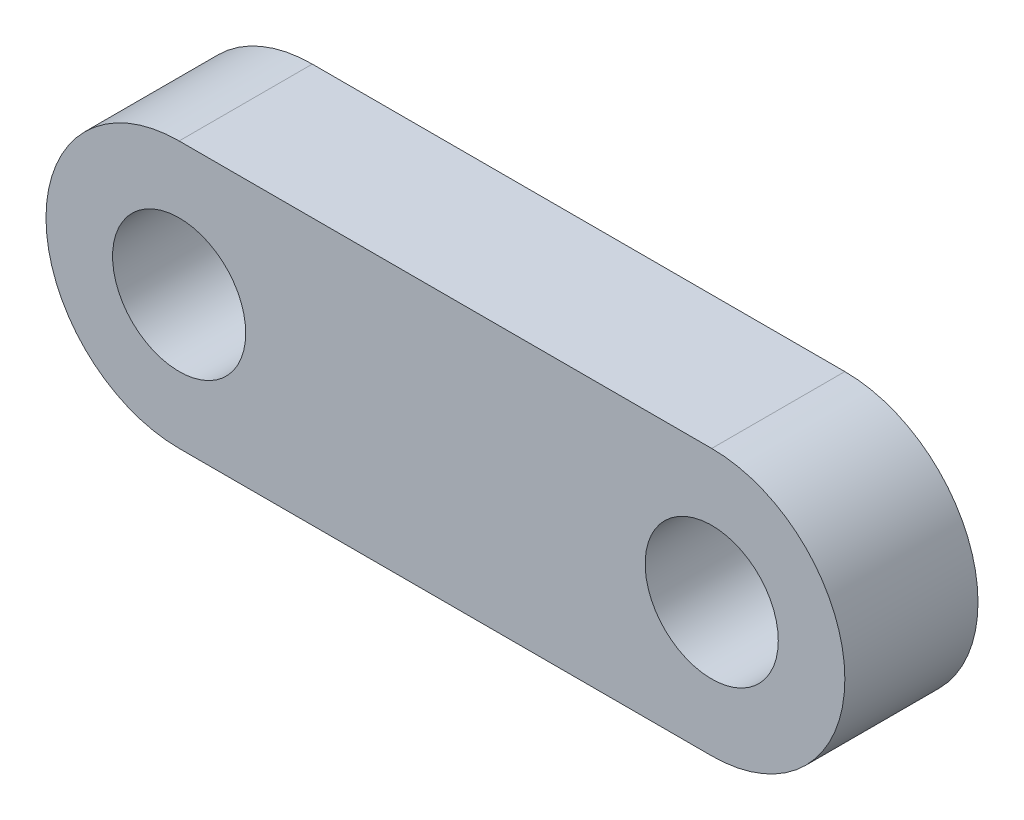
ISO-10303-21;
HEADER;
FILE_DESCRIPTION(('STEP AP214'),'2;1');
FILE_NAME('part.step','',(''),(''),'','','');
FILE_SCHEMA(('AUTOMOTIVE_DESIGN { 1 0 10303 214 1 1 1 1 }'));
ENDSEC;
DATA;
#1=APPLICATION_CONTEXT('core data for automotive mechanical design processes');
#2=APPLICATION_PROTOCOL_DEFINITION('international standard','automotive_design',2000,#1);
#3=PRODUCT_CONTEXT('',#1,'mechanical');
#4=PRODUCT('Part','Part','',(#3));
#5=PRODUCT_RELATED_PRODUCT_CATEGORY('part','',(#4));
#6=PRODUCT_DEFINITION_FORMATION('','',#4);
#7=PRODUCT_DEFINITION_CONTEXT('part definition',#1,'design');
#8=PRODUCT_DEFINITION('design','',#6,#7);
#9=PRODUCT_DEFINITION_SHAPE('','',#8);
#10=(LENGTH_UNIT() NAMED_UNIT(*) SI_UNIT(.MILLI.,.METRE.));
#11=(NAMED_UNIT(*) PLANE_ANGLE_UNIT() SI_UNIT($,.RADIAN.));
#12=(NAMED_UNIT(*) SI_UNIT($,.STERADIAN.) SOLID_ANGLE_UNIT());
#13=UNCERTAINTY_MEASURE_WITH_UNIT(LENGTH_MEASURE(1.E-05),#10,'distance_accuracy_value','');
#14=(GEOMETRIC_REPRESENTATION_CONTEXT(3) GLOBAL_UNCERTAINTY_ASSIGNED_CONTEXT((#13)) GLOBAL_UNIT_ASSIGNED_CONTEXT((#10,
#11,#12)) REPRESENTATION_CONTEXT('',''));
#15=CARTESIAN_POINT('',(0.,0.,0.));
#16=DIRECTION('',(0.,0.,1.));
#17=DIRECTION('',(1.,0.,0.));
#18=AXIS2_PLACEMENT_3D('',#15,#16,#17);
#19=CARTESIAN_POINT('',(0.,0.,2.5));
#20=DIRECTION('',(0.,0.,1.));
#21=DIRECTION('',(1.,0.,0.));
#22=AXIS2_PLACEMENT_3D('',#19,#20,#21);
#23=PLANE('',#22);
#24=CARTESIAN_POINT('',(0.,0.,2.5));
#25=DIRECTION('',(0.,0.,1.));
#26=DIRECTION('',(1.,0.,0.));
#27=AXIS2_PLACEMENT_3D('',#24,#25,#26);
#28=CIRCLE('',#27,1.25);
#29=CARTESIAN_POINT('',(1.25,0.,2.5));
#30=VERTEX_POINT('',#29);
#31=EDGE_CURVE('E100',#30,#30,#28,.T.);
#32=ORIENTED_EDGE('',*,*,#31,.F.);
#33=EDGE_LOOP('',(#32));
#34=FACE_BOUND('',#33,.T.);
#35=CARTESIAN_POINT('',(0.,0.,2.5));
#36=DIRECTION('',(0.,0.,1.));
#37=DIRECTION('',(1.,0.,0.));
#38=AXIS2_PLACEMENT_3D('',#35,#36,#37);
#39=CIRCLE('',#38,2.5);
#40=CARTESIAN_POINT('',(0.,2.5,2.5));
#41=VERTEX_POINT('',#40);
#42=CARTESIAN_POINT('',(0.,-2.5,2.5));
#43=VERTEX_POINT('',#42);
#44=EDGE_CURVE('E85',#41,#43,#39,.T.);
#45=ORIENTED_EDGE('',*,*,#44,.T.);
#46=DIRECTION('',(1.,0.,0.));
#47=VECTOR('',#46,1.);
#48=CARTESIAN_POINT('',(0.,-2.5,2.5));
#49=LINE('',#48,#47);
#50=CARTESIAN_POINT('',(10.,-2.5,2.5));
#51=VERTEX_POINT('',#50);
#52=EDGE_CURVE('E80',#43,#51,#49,.T.);
#53=ORIENTED_EDGE('',*,*,#52,.T.);
#54=CARTESIAN_POINT('',(10.,0.,2.5));
#55=DIRECTION('',(0.,0.,1.));
#56=DIRECTION('',(1.,0.,0.));
#57=AXIS2_PLACEMENT_3D('',#54,#55,#56);
#58=CIRCLE('',#57,2.5);
#59=CARTESIAN_POINT('',(10.,2.5,2.5));
#60=VERTEX_POINT('',#59);
#61=EDGE_CURVE('E83',#51,#60,#58,.T.);
#62=ORIENTED_EDGE('',*,*,#61,.T.);
#63=DIRECTION('',(-1.,0.,0.));
#64=VECTOR('',#63,1.);
#65=CARTESIAN_POINT('',(0.,2.5,2.5));
#66=LINE('',#65,#64);
#67=EDGE_CURVE('E50',#60,#41,#66,.T.);
#68=ORIENTED_EDGE('',*,*,#67,.T.);
#69=EDGE_LOOP('',(#45,#53,#62,#68));
#70=FACE_BOUND('',#69,.T.);
#71=CARTESIAN_POINT('',(10.,0.,2.5));
#72=DIRECTION('',(0.,0.,1.));
#73=DIRECTION('',(1.,0.,0.));
#74=AXIS2_PLACEMENT_3D('',#71,#72,#73);
#75=CIRCLE('',#74,1.25);
#76=CARTESIAN_POINT('',(11.25,0.,2.5));
#77=VERTEX_POINT('',#76);
#78=EDGE_CURVE('E115',#77,#77,#75,.T.);
#79=ORIENTED_EDGE('',*,*,#78,.F.);
#80=EDGE_LOOP('',(#79));
#81=FACE_BOUND('',#80,.T.);
#82=ADVANCED_FACE('F33',(#34,#70,#81),#23,.T.);
#83=CARTESIAN_POINT('',(0.,0.,0.));
#84=DIRECTION('',(0.,0.,1.));
#85=DIRECTION('',(1.,0.,0.));
#86=AXIS2_PLACEMENT_3D('',#83,#84,#85);
#87=PLANE('',#86);
#88=CARTESIAN_POINT('',(0.,0.,0.));
#89=DIRECTION('',(0.,0.,1.));
#90=DIRECTION('',(1.,0.,0.));
#91=AXIS2_PLACEMENT_3D('',#88,#89,#90);
#92=CIRCLE('',#91,2.5);
#93=CARTESIAN_POINT('',(0.,2.5,0.));
#94=VERTEX_POINT('',#93);
#95=CARTESIAN_POINT('',(0.,-2.5,0.));
#96=VERTEX_POINT('',#95);
#97=EDGE_CURVE('E97',#94,#96,#92,.T.);
#98=ORIENTED_EDGE('',*,*,#97,.F.);
#99=DIRECTION('',(-1.,0.,0.));
#100=VECTOR('',#99,1.);
#101=CARTESIAN_POINT('',(0.,2.5,0.));
#102=LINE('',#101,#100);
#103=CARTESIAN_POINT('',(10.,2.5,0.));
#104=VERTEX_POINT('',#103);
#105=EDGE_CURVE('E73',#104,#94,#102,.T.);
#106=ORIENTED_EDGE('',*,*,#105,.F.);
#107=CARTESIAN_POINT('',(10.,0.,0.));
#108=DIRECTION('',(0.,0.,1.));
#109=DIRECTION('',(1.,0.,0.));
#110=AXIS2_PLACEMENT_3D('',#107,#108,#109);
#111=CIRCLE('',#110,2.5);
#112=CARTESIAN_POINT('',(10.,-2.5,0.));
#113=VERTEX_POINT('',#112);
#114=EDGE_CURVE('E67',#113,#104,#111,.T.);
#115=ORIENTED_EDGE('',*,*,#114,.F.);
#116=DIRECTION('',(1.,0.,0.));
#117=VECTOR('',#116,1.);
#118=CARTESIAN_POINT('',(0.,-2.5,0.));
#119=LINE('',#118,#117);
#120=EDGE_CURVE('E89',#96,#113,#119,.T.);
#121=ORIENTED_EDGE('',*,*,#120,.F.);
#122=EDGE_LOOP('',(#98,#106,#115,#121));
#123=FACE_BOUND('',#122,.T.);
#124=CARTESIAN_POINT('',(0.,0.,0.));
#125=DIRECTION('',(0.,0.,1.));
#126=DIRECTION('',(1.,0.,0.));
#127=AXIS2_PLACEMENT_3D('',#124,#125,#126);
#128=CIRCLE('',#127,1.25);
#129=CARTESIAN_POINT('',(1.25,0.,0.));
#130=VERTEX_POINT('',#129);
#131=EDGE_CURVE('E112',#130,#130,#128,.T.);
#132=ORIENTED_EDGE('',*,*,#131,.T.);
#133=EDGE_LOOP('',(#132));
#134=FACE_BOUND('',#133,.T.);
#135=CARTESIAN_POINT('',(10.,0.,0.));
#136=DIRECTION('',(0.,0.,1.));
#137=DIRECTION('',(1.,0.,0.));
#138=AXIS2_PLACEMENT_3D('',#135,#136,#137);
#139=CIRCLE('',#138,1.25);
#140=CARTESIAN_POINT('',(11.25,0.,0.));
#141=VERTEX_POINT('',#140);
#142=EDGE_CURVE('E118',#141,#141,#139,.T.);
#143=ORIENTED_EDGE('',*,*,#142,.T.);
#144=EDGE_LOOP('',(#143));
#145=FACE_BOUND('',#144,.T.);
#146=ADVANCED_FACE('F108',(#123,#134,#145),#87,.F.);
#147=CARTESIAN_POINT('',(0.,0.,2.5));
#148=DIRECTION('',(0.,0.,-1.));
#149=DIRECTION('',(-1.,0.,0.));
#150=AXIS2_PLACEMENT_3D('',#147,#148,#149);
#151=CYLINDRICAL_SURFACE('',#150,2.5);
#152=ORIENTED_EDGE('',*,*,#97,.T.);
#153=DIRECTION('',(0.,0.,-1.));
#154=VECTOR('',#153,1.);
#155=CARTESIAN_POINT('',(0.,-2.5,2.5));
#156=LINE('',#155,#154);
#157=EDGE_CURVE('E11',#43,#96,#156,.T.);
#158=ORIENTED_EDGE('',*,*,#157,.F.);
#159=ORIENTED_EDGE('',*,*,#44,.F.);
#160=DIRECTION('',(0.,0.,-1.));
#161=VECTOR('',#160,1.);
#162=CARTESIAN_POINT('',(0.,2.5,2.5));
#163=LINE('',#162,#161);
#164=EDGE_CURVE('E93',#41,#94,#163,.T.);
#165=ORIENTED_EDGE('',*,*,#164,.T.);
#166=EDGE_LOOP('',(#152,#158,#159,#165));
#167=FACE_BOUND('',#166,.T.);
#168=ADVANCED_FACE('F35',(#167),#151,.T.);
#169=CARTESIAN_POINT('',(0.,-2.5,2.5));
#170=DIRECTION('',(0.,1.,0.));
#171=DIRECTION('',(0.,0.,1.));
#172=AXIS2_PLACEMENT_3D('',#169,#170,#171);
#173=PLANE('',#172);
#174=ORIENTED_EDGE('',*,*,#120,.T.);
#175=DIRECTION('',(0.,0.,-1.));
#176=VECTOR('',#175,1.);
#177=CARTESIAN_POINT('',(10.,-2.5,2.5));
#178=LINE('',#177,#176);
#179=EDGE_CURVE('E42',#51,#113,#178,.T.);
#180=ORIENTED_EDGE('',*,*,#179,.F.);
#181=ORIENTED_EDGE('',*,*,#52,.F.);
#182=ORIENTED_EDGE('',*,*,#157,.T.);
#183=EDGE_LOOP('',(#174,#180,#181,#182));
#184=FACE_BOUND('',#183,.T.);
#185=ADVANCED_FACE('F88',(#184),#173,.F.);
#186=CARTESIAN_POINT('',(10.,0.,2.5));
#187=DIRECTION('',(0.,0.,-1.));
#188=DIRECTION('',(-1.,0.,0.));
#189=AXIS2_PLACEMENT_3D('',#186,#187,#188);
#190=CYLINDRICAL_SURFACE('',#189,2.5);
#191=ORIENTED_EDGE('',*,*,#114,.T.);
#192=DIRECTION('',(0.,0.,-1.));
#193=VECTOR('',#192,1.);
#194=CARTESIAN_POINT('',(10.,2.5,2.5));
#195=LINE('',#194,#193);
#196=EDGE_CURVE('E90',#60,#104,#195,.T.);
#197=ORIENTED_EDGE('',*,*,#196,.F.);
#198=ORIENTED_EDGE('',*,*,#61,.F.);
#199=ORIENTED_EDGE('',*,*,#179,.T.);
#200=EDGE_LOOP('',(#191,#197,#198,#199));
#201=FACE_BOUND('',#200,.T.);
#202=ADVANCED_FACE('F91',(#201),#190,.T.);
#203=CARTESIAN_POINT('',(0.,2.5,2.5));
#204=DIRECTION('',(0.,-1.,0.));
#205=DIRECTION('',(0.,0.,-1.));
#206=AXIS2_PLACEMENT_3D('',#203,#204,#205);
#207=PLANE('',#206);
#208=ORIENTED_EDGE('',*,*,#105,.T.);
#209=ORIENTED_EDGE('',*,*,#164,.F.);
#210=ORIENTED_EDGE('',*,*,#67,.F.);
#211=ORIENTED_EDGE('',*,*,#196,.T.);
#212=EDGE_LOOP('',(#208,#209,#210,#211));
#213=FACE_BOUND('',#212,.T.);
#214=ADVANCED_FACE('F105',(#213),#207,.F.);
#215=CARTESIAN_POINT('',(0.,0.,2.5));
#216=DIRECTION('',(0.,0.,-1.));
#217=DIRECTION('',(-1.,0.,0.));
#218=AXIS2_PLACEMENT_3D('',#215,#216,#217);
#219=CYLINDRICAL_SURFACE('',#218,1.25);
#220=ORIENTED_EDGE('',*,*,#31,.T.);
#221=EDGE_LOOP('',(#220));
#222=FACE_BOUND('',#221,.T.);
#223=ORIENTED_EDGE('',*,*,#131,.F.);
#224=EDGE_LOOP('',(#223));
#225=FACE_BOUND('',#224,.T.);
#226=ADVANCED_FACE('F135',(#222,#225),#219,.F.);
#227=CARTESIAN_POINT('',(10.,0.,2.5));
#228=DIRECTION('',(0.,0.,-1.));
#229=DIRECTION('',(-1.,0.,0.));
#230=AXIS2_PLACEMENT_3D('',#227,#228,#229);
#231=CYLINDRICAL_SURFACE('',#230,1.25);
#232=ORIENTED_EDGE('',*,*,#78,.T.);
#233=EDGE_LOOP('',(#232));
#234=FACE_BOUND('',#233,.T.);
#235=ORIENTED_EDGE('',*,*,#142,.F.);
#236=EDGE_LOOP('',(#235));
#237=FACE_BOUND('',#236,.T.);
#238=ADVANCED_FACE('F124',(#234,#237),#231,.F.);
#239=CLOSED_SHELL('',(#82,#146,#168,#185,#202,#214,#226,#238));
#240=MANIFOLD_SOLID_BREP('B2',#239);
#241=ADVANCED_BREP_SHAPE_REPRESENTATION('',(#18,#240),#14);
#242=SHAPE_DEFINITION_REPRESENTATION(#9,#241);
ENDSEC;
END-ISO-10303-21;
